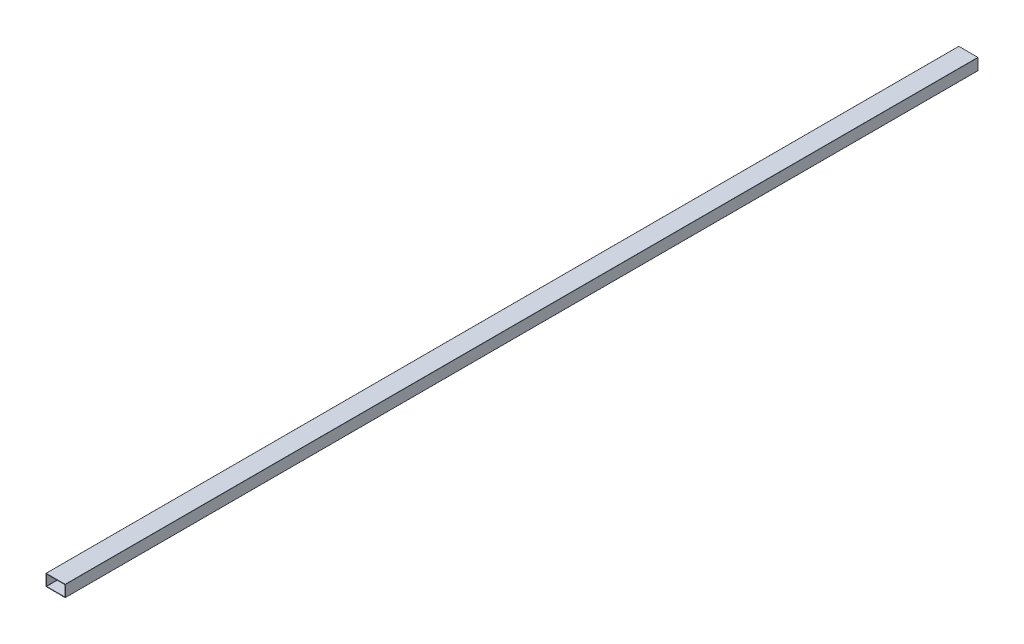
ISO-10303-21;
HEADER;
FILE_DESCRIPTION(('STEP AP214'),'2;1');
FILE_NAME('part.step','',(''),(''),'','','');
FILE_SCHEMA(('AUTOMOTIVE_DESIGN { 1 0 10303 214 1 1 1 1 }'));
ENDSEC;
DATA;
#1=APPLICATION_CONTEXT('core data for automotive mechanical design processes');
#2=APPLICATION_PROTOCOL_DEFINITION('international standard','automotive_design',2000,#1);
#3=PRODUCT_CONTEXT('',#1,'mechanical');
#4=PRODUCT('Part','Part','',(#3));
#5=PRODUCT_RELATED_PRODUCT_CATEGORY('part','',(#4));
#6=PRODUCT_DEFINITION_FORMATION('','',#4);
#7=PRODUCT_DEFINITION_CONTEXT('part definition',#1,'design');
#8=PRODUCT_DEFINITION('design','',#6,#7);
#9=PRODUCT_DEFINITION_SHAPE('','',#8);
#10=(LENGTH_UNIT() NAMED_UNIT(*) SI_UNIT(.MILLI.,.METRE.));
#11=(NAMED_UNIT(*) PLANE_ANGLE_UNIT() SI_UNIT($,.RADIAN.));
#12=(NAMED_UNIT(*) SI_UNIT($,.STERADIAN.) SOLID_ANGLE_UNIT());
#13=UNCERTAINTY_MEASURE_WITH_UNIT(LENGTH_MEASURE(1.E-05),#10,'distance_accuracy_value','');
#14=(GEOMETRIC_REPRESENTATION_CONTEXT(3) GLOBAL_UNCERTAINTY_ASSIGNED_CONTEXT((#13)) GLOBAL_UNIT_ASSIGNED_CONTEXT((#10,
#11,#12)) REPRESENTATION_CONTEXT('',''));
#15=CARTESIAN_POINT('',(0.,0.,0.));
#16=DIRECTION('',(0.,0.,1.));
#17=DIRECTION('',(1.,0.,0.));
#18=AXIS2_PLACEMENT_3D('',#15,#16,#17);
#19=CARTESIAN_POINT('',(63.5,-38.1,-6000.));
#20=DIRECTION('',(1.,0.,0.));
#21=DIRECTION('',(0.,0.,-1.));
#22=AXIS2_PLACEMENT_3D('',#19,#20,#21);
#23=PLANE('',#22);
#24=DIRECTION('',(0.,1.,0.));
#25=VECTOR('',#24,1.);
#26=CARTESIAN_POINT('',(63.5,-38.1,0.));
#27=LINE('',#26,#25);
#28=CARTESIAN_POINT('',(63.5,-37.1,0.));
#29=VERTEX_POINT('',#28);
#30=CARTESIAN_POINT('',(63.5,37.1,0.));
#31=VERTEX_POINT('',#30);
#32=EDGE_CURVE('E197',#29,#31,#27,.T.);
#33=ORIENTED_EDGE('',*,*,#32,.F.);
#34=DIRECTION('',(0.,0.,1.));
#35=VECTOR('',#34,1.);
#36=CARTESIAN_POINT('',(63.5,-37.1,-6000.));
#37=LINE('',#36,#35);
#38=CARTESIAN_POINT('',(63.5,-37.1,-6000.));
#39=VERTEX_POINT('',#38);
#40=EDGE_CURVE('E158',#29,#39,#37,.F.);
#41=ORIENTED_EDGE('',*,*,#40,.T.);
#42=DIRECTION('',(0.,1.,0.));
#43=VECTOR('',#42,1.);
#44=CARTESIAN_POINT('',(63.5,-38.1,-6000.));
#45=LINE('',#44,#43);
#46=CARTESIAN_POINT('',(63.5,37.1,-6000.));
#47=VERTEX_POINT('',#46);
#48=EDGE_CURVE('E185',#39,#47,#45,.T.);
#49=ORIENTED_EDGE('',*,*,#48,.T.);
#50=DIRECTION('',(0.,0.,1.));
#51=VECTOR('',#50,1.);
#52=CARTESIAN_POINT('',(63.5,37.1,-6000.));
#53=LINE('',#52,#51);
#54=EDGE_CURVE('E251',#47,#31,#53,.T.);
#55=ORIENTED_EDGE('',*,*,#54,.T.);
#56=EDGE_LOOP('',(#33,#41,#49,#55));
#57=FACE_BOUND('',#56,.T.);
#58=ADVANCED_FACE('F33',(#57),#23,.T.);
#59=CARTESIAN_POINT('',(-63.5,-38.1,-6000.));
#60=DIRECTION('',(0.,-1.,0.));
#61=DIRECTION('',(0.,0.,-1.));
#62=AXIS2_PLACEMENT_3D('',#59,#60,#61);
#63=PLANE('',#62);
#64=DIRECTION('',(1.,0.,0.));
#65=VECTOR('',#64,1.);
#66=CARTESIAN_POINT('',(-63.5,-38.1,0.));
#67=LINE('',#66,#65);
#68=CARTESIAN_POINT('',(-62.5,-38.1,0.));
#69=VERTEX_POINT('',#68);
#70=CARTESIAN_POINT('',(62.5,-38.1,0.));
#71=VERTEX_POINT('',#70);
#72=EDGE_CURVE('E189',#69,#71,#67,.T.);
#73=ORIENTED_EDGE('',*,*,#72,.F.);
#74=DIRECTION('',(0.,0.,1.));
#75=VECTOR('',#74,1.);
#76=CARTESIAN_POINT('',(-62.5,-38.1,-6000.));
#77=LINE('',#76,#75);
#78=CARTESIAN_POINT('',(-62.5,-38.1,-6000.));
#79=VERTEX_POINT('',#78);
#80=EDGE_CURVE('E238',#69,#79,#77,.F.);
#81=ORIENTED_EDGE('',*,*,#80,.T.);
#82=DIRECTION('',(1.,0.,0.));
#83=VECTOR('',#82,1.);
#84=CARTESIAN_POINT('',(-63.5,-38.1,-6000.));
#85=LINE('',#84,#83);
#86=CARTESIAN_POINT('',(62.5,-38.1,-6000.));
#87=VERTEX_POINT('',#86);
#88=EDGE_CURVE('E194',#79,#87,#85,.T.);
#89=ORIENTED_EDGE('',*,*,#88,.T.);
#90=DIRECTION('',(0.,0.,1.));
#91=VECTOR('',#90,1.);
#92=CARTESIAN_POINT('',(62.5,-38.1,-6000.));
#93=LINE('',#92,#91);
#94=EDGE_CURVE('E235',#87,#71,#93,.T.);
#95=ORIENTED_EDGE('',*,*,#94,.T.);
#96=EDGE_LOOP('',(#73,#81,#89,#95));
#97=FACE_BOUND('',#96,.T.);
#98=ADVANCED_FACE('F305',(#97),#63,.T.);
#99=CARTESIAN_POINT('',(-63.5,-38.1,-6000.));
#100=DIRECTION('',(-1.,0.,0.));
#101=DIRECTION('',(0.,0.,1.));
#102=AXIS2_PLACEMENT_3D('',#99,#100,#101);
#103=PLANE('',#102);
#104=DIRECTION('',(0.,-1.,0.));
#105=VECTOR('',#104,1.);
#106=CARTESIAN_POINT('',(-63.5,-38.1,-6000.));
#107=LINE('',#106,#105);
#108=CARTESIAN_POINT('',(-63.5,37.1,-6000.));
#109=VERTEX_POINT('',#108);
#110=CARTESIAN_POINT('',(-63.5,-37.1,-6000.));
#111=VERTEX_POINT('',#110);
#112=EDGE_CURVE('E191',#109,#111,#107,.T.);
#113=ORIENTED_EDGE('',*,*,#112,.T.);
#114=DIRECTION('',(0.,0.,1.));
#115=VECTOR('',#114,1.);
#116=CARTESIAN_POINT('',(-63.5,-37.1,-6000.));
#117=LINE('',#116,#115);
#118=CARTESIAN_POINT('',(-63.5,-37.1,0.));
#119=VERTEX_POINT('',#118);
#120=EDGE_CURVE('E224',#111,#119,#117,.T.);
#121=ORIENTED_EDGE('',*,*,#120,.T.);
#122=DIRECTION('',(0.,-1.,0.));
#123=VECTOR('',#122,1.);
#124=CARTESIAN_POINT('',(-63.5,-38.1,0.));
#125=LINE('',#124,#123);
#126=CARTESIAN_POINT('',(-63.5,37.1,0.));
#127=VERTEX_POINT('',#126);
#128=EDGE_CURVE('E203',#127,#119,#125,.T.);
#129=ORIENTED_EDGE('',*,*,#128,.F.);
#130=DIRECTION('',(0.,0.,1.));
#131=VECTOR('',#130,1.);
#132=CARTESIAN_POINT('',(-63.5,37.1,-6000.));
#133=LINE('',#132,#131);
#134=EDGE_CURVE('E222',#127,#109,#133,.F.);
#135=ORIENTED_EDGE('',*,*,#134,.T.);
#136=EDGE_LOOP('',(#113,#121,#129,#135));
#137=FACE_BOUND('',#136,.T.);
#138=ADVANCED_FACE('F311',(#137),#103,.T.);
#139=CARTESIAN_POINT('',(-63.5,38.1,-6000.));
#140=DIRECTION('',(0.,1.,0.));
#141=DIRECTION('',(0.,0.,1.));
#142=AXIS2_PLACEMENT_3D('',#139,#140,#141);
#143=PLANE('',#142);
#144=DIRECTION('',(-1.,0.,0.));
#145=VECTOR('',#144,1.);
#146=CARTESIAN_POINT('',(-63.5,38.1,-6000.));
#147=LINE('',#146,#145);
#148=CARTESIAN_POINT('',(62.5,38.1,-6000.));
#149=VERTEX_POINT('',#148);
#150=CARTESIAN_POINT('',(-62.5,38.1,-6000.));
#151=VERTEX_POINT('',#150);
#152=EDGE_CURVE('E188',#149,#151,#147,.T.);
#153=ORIENTED_EDGE('',*,*,#152,.T.);
#154=DIRECTION('',(0.,0.,1.));
#155=VECTOR('',#154,1.);
#156=CARTESIAN_POINT('',(-62.5,38.1,-6000.));
#157=LINE('',#156,#155);
#158=CARTESIAN_POINT('',(-62.5,38.1,0.));
#159=VERTEX_POINT('',#158);
#160=EDGE_CURVE('E248',#151,#159,#157,.T.);
#161=ORIENTED_EDGE('',*,*,#160,.T.);
#162=DIRECTION('',(-1.,0.,0.));
#163=VECTOR('',#162,1.);
#164=CARTESIAN_POINT('',(-63.5,38.1,0.));
#165=LINE('',#164,#163);
#166=CARTESIAN_POINT('',(62.5,38.1,0.));
#167=VERTEX_POINT('',#166);
#168=EDGE_CURVE('E200',#167,#159,#165,.T.);
#169=ORIENTED_EDGE('',*,*,#168,.F.);
#170=DIRECTION('',(0.,0.,1.));
#171=VECTOR('',#170,1.);
#172=CARTESIAN_POINT('',(62.5,38.1,-6000.));
#173=LINE('',#172,#171);
#174=EDGE_CURVE('E55',#167,#149,#173,.F.);
#175=ORIENTED_EDGE('',*,*,#174,.T.);
#176=EDGE_LOOP('',(#153,#161,#169,#175));
#177=FACE_BOUND('',#176,.T.);
#178=ADVANCED_FACE('F316',(#177),#143,.T.);
#179=CARTESIAN_POINT('',(0.,0.,-6000.));
#180=DIRECTION('',(0.,0.,-1.));
#181=DIRECTION('',(-1.,0.,0.));
#182=AXIS2_PLACEMENT_3D('',#179,#180,#181);
#183=PLANE('',#182);
#184=DIRECTION('',(0.,-1.,0.));
#185=VECTOR('',#184,1.);
#186=CARTESIAN_POINT('',(-60.46,-35.06,-6000.));
#187=LINE('',#186,#185);
#188=CARTESIAN_POINT('',(-60.46,34.06,-6000.));
#189=VERTEX_POINT('',#188);
#190=CARTESIAN_POINT('',(-60.46,-34.06,-6000.));
#191=VERTEX_POINT('',#190);
#192=EDGE_CURVE('E167',#189,#191,#187,.T.);
#193=ORIENTED_EDGE('',*,*,#192,.T.);
#194=CARTESIAN_POINT('',(-59.46,-34.06,-6000.));
#195=DIRECTION('',(0.,0.,-1.));
#196=DIRECTION('',(-1.,0.,0.));
#197=AXIS2_PLACEMENT_3D('',#194,#195,#196);
#198=CIRCLE('',#197,1.);
#199=CARTESIAN_POINT('',(-59.46,-35.06,-6000.));
#200=VERTEX_POINT('',#199);
#201=EDGE_CURVE('E11',#191,#200,#198,.F.);
#202=ORIENTED_EDGE('',*,*,#201,.T.);
#203=DIRECTION('',(1.,0.,0.));
#204=VECTOR('',#203,1.);
#205=CARTESIAN_POINT('',(-60.46,-35.06,-6000.));
#206=LINE('',#205,#204);
#207=CARTESIAN_POINT('',(59.46,-35.06,-6000.));
#208=VERTEX_POINT('',#207);
#209=EDGE_CURVE('E175',#200,#208,#206,.T.);
#210=ORIENTED_EDGE('',*,*,#209,.T.);
#211=CARTESIAN_POINT('',(59.46,-34.06,-6000.));
#212=DIRECTION('',(0.,0.,-1.));
#213=DIRECTION('',(-1.,0.,0.));
#214=AXIS2_PLACEMENT_3D('',#211,#212,#213);
#215=CIRCLE('',#214,1.);
#216=CARTESIAN_POINT('',(60.46,-34.06,-6000.));
#217=VERTEX_POINT('',#216);
#218=EDGE_CURVE('E262',#208,#217,#215,.F.);
#219=ORIENTED_EDGE('',*,*,#218,.T.);
#220=DIRECTION('',(0.,1.,0.));
#221=VECTOR('',#220,1.);
#222=CARTESIAN_POINT('',(60.46,-35.06,-6000.));
#223=LINE('',#222,#221);
#224=CARTESIAN_POINT('',(60.46,34.06,-6000.));
#225=VERTEX_POINT('',#224);
#226=EDGE_CURVE('E179',#217,#225,#223,.T.);
#227=ORIENTED_EDGE('',*,*,#226,.T.);
#228=CARTESIAN_POINT('',(59.46,34.06,-6000.));
#229=DIRECTION('',(0.,0.,-1.));
#230=DIRECTION('',(-1.,0.,0.));
#231=AXIS2_PLACEMENT_3D('',#228,#229,#230);
#232=CIRCLE('',#231,1.);
#233=CARTESIAN_POINT('',(59.46,35.06,-6000.));
#234=VERTEX_POINT('',#233);
#235=EDGE_CURVE('E258',#225,#234,#232,.F.);
#236=ORIENTED_EDGE('',*,*,#235,.T.);
#237=DIRECTION('',(-1.,0.,0.));
#238=VECTOR('',#237,1.);
#239=CARTESIAN_POINT('',(-60.46,35.06,-6000.));
#240=LINE('',#239,#238);
#241=CARTESIAN_POINT('',(-59.46,35.06,-6000.));
#242=VERTEX_POINT('',#241);
#243=EDGE_CURVE('E277',#234,#242,#240,.T.);
#244=ORIENTED_EDGE('',*,*,#243,.T.);
#245=CARTESIAN_POINT('',(-59.46,34.06,-6000.));
#246=DIRECTION('',(0.,0.,-1.));
#247=DIRECTION('',(-1.,0.,0.));
#248=AXIS2_PLACEMENT_3D('',#245,#246,#247);
#249=CIRCLE('',#248,1.);
#250=EDGE_CURVE('E157',#242,#189,#249,.F.);
#251=ORIENTED_EDGE('',*,*,#250,.T.);
#252=EDGE_LOOP('',(#193,#202,#210,#219,#227,#236,#244,#251));
#253=FACE_BOUND('',#252,.T.);
#254=ORIENTED_EDGE('',*,*,#88,.F.);
#255=CARTESIAN_POINT('',(-62.5,-37.1,-6000.));
#256=DIRECTION('',(0.,0.,-1.));
#257=DIRECTION('',(-1.,0.,0.));
#258=AXIS2_PLACEMENT_3D('',#255,#256,#257);
#259=CIRCLE('',#258,1.);
#260=EDGE_CURVE('E245',#79,#111,#259,.T.);
#261=ORIENTED_EDGE('',*,*,#260,.T.);
#262=ORIENTED_EDGE('',*,*,#112,.F.);
#263=CARTESIAN_POINT('',(-62.5,37.1,-6000.));
#264=DIRECTION('',(0.,0.,-1.));
#265=DIRECTION('',(-1.,0.,0.));
#266=AXIS2_PLACEMENT_3D('',#263,#264,#265);
#267=CIRCLE('',#266,1.);
#268=EDGE_CURVE('E48',#109,#151,#267,.T.);
#269=ORIENTED_EDGE('',*,*,#268,.T.);
#270=ORIENTED_EDGE('',*,*,#152,.F.);
#271=CARTESIAN_POINT('',(62.5,37.1,-6000.));
#272=DIRECTION('',(0.,0.,-1.));
#273=DIRECTION('',(-1.,0.,0.));
#274=AXIS2_PLACEMENT_3D('',#271,#272,#273);
#275=CIRCLE('',#274,1.);
#276=EDGE_CURVE('E240',#149,#47,#275,.T.);
#277=ORIENTED_EDGE('',*,*,#276,.T.);
#278=ORIENTED_EDGE('',*,*,#48,.F.);
#279=CARTESIAN_POINT('',(62.5,-37.1,-6000.));
#280=DIRECTION('',(0.,0.,-1.));
#281=DIRECTION('',(-1.,0.,0.));
#282=AXIS2_PLACEMENT_3D('',#279,#280,#281);
#283=CIRCLE('',#282,1.);
#284=EDGE_CURVE('E242',#39,#87,#283,.T.);
#285=ORIENTED_EDGE('',*,*,#284,.T.);
#286=EDGE_LOOP('',(#254,#261,#262,#269,#270,#277,#278,#285));
#287=FACE_BOUND('',#286,.T.);
#288=ADVANCED_FACE('F267',(#253,#287),#183,.T.);
#289=CARTESIAN_POINT('',(0.,0.,0.));
#290=DIRECTION('',(0.,0.,-1.));
#291=DIRECTION('',(-1.,0.,0.));
#292=AXIS2_PLACEMENT_3D('',#289,#290,#291);
#293=PLANE('',#292);
#294=DIRECTION('',(0.,1.,0.));
#295=VECTOR('',#294,1.);
#296=CARTESIAN_POINT('',(60.46,-35.06,0.));
#297=LINE('',#296,#295);
#298=CARTESIAN_POINT('',(60.46,-34.06,0.));
#299=VERTEX_POINT('',#298);
#300=CARTESIAN_POINT('',(60.46,34.06,0.));
#301=VERTEX_POINT('',#300);
#302=EDGE_CURVE('E181',#299,#301,#297,.T.);
#303=ORIENTED_EDGE('',*,*,#302,.F.);
#304=CARTESIAN_POINT('',(59.46,-34.06,0.));
#305=DIRECTION('',(0.,0.,-1.));
#306=DIRECTION('',(-1.,0.,0.));
#307=AXIS2_PLACEMENT_3D('',#304,#305,#306);
#308=CIRCLE('',#307,1.);
#309=CARTESIAN_POINT('',(59.46,-35.06,0.));
#310=VERTEX_POINT('',#309);
#311=EDGE_CURVE('E260',#299,#310,#308,.T.);
#312=ORIENTED_EDGE('',*,*,#311,.T.);
#313=DIRECTION('',(1.,0.,0.));
#314=VECTOR('',#313,1.);
#315=CARTESIAN_POINT('',(-60.46,-35.06,0.));
#316=LINE('',#315,#314);
#317=CARTESIAN_POINT('',(-59.46,-35.06,0.));
#318=VERTEX_POINT('',#317);
#319=EDGE_CURVE('E281',#318,#310,#316,.T.);
#320=ORIENTED_EDGE('',*,*,#319,.F.);
#321=CARTESIAN_POINT('',(-59.46,-34.06,0.));
#322=DIRECTION('',(0.,0.,-1.));
#323=DIRECTION('',(-1.,0.,0.));
#324=AXIS2_PLACEMENT_3D('',#321,#322,#323);
#325=CIRCLE('',#324,1.);
#326=CARTESIAN_POINT('',(-60.46,-34.06,0.));
#327=VERTEX_POINT('',#326);
#328=EDGE_CURVE('E41',#318,#327,#325,.T.);
#329=ORIENTED_EDGE('',*,*,#328,.T.);
#330=DIRECTION('',(0.,-1.,0.));
#331=VECTOR('',#330,1.);
#332=CARTESIAN_POINT('',(-60.46,-35.06,0.));
#333=LINE('',#332,#331);
#334=CARTESIAN_POINT('',(-60.46,34.06,0.));
#335=VERTEX_POINT('',#334);
#336=EDGE_CURVE('E164',#335,#327,#333,.T.);
#337=ORIENTED_EDGE('',*,*,#336,.F.);
#338=CARTESIAN_POINT('',(-59.46,34.06,0.));
#339=DIRECTION('',(0.,0.,-1.));
#340=DIRECTION('',(-1.,0.,0.));
#341=AXIS2_PLACEMENT_3D('',#338,#339,#340);
#342=CIRCLE('',#341,1.);
#343=CARTESIAN_POINT('',(-59.46,35.06,0.));
#344=VERTEX_POINT('',#343);
#345=EDGE_CURVE('E147',#335,#344,#342,.T.);
#346=ORIENTED_EDGE('',*,*,#345,.T.);
#347=DIRECTION('',(-1.,0.,0.));
#348=VECTOR('',#347,1.);
#349=CARTESIAN_POINT('',(-60.46,35.06,0.));
#350=LINE('',#349,#348);
#351=CARTESIAN_POINT('',(59.46,35.06,0.));
#352=VERTEX_POINT('',#351);
#353=EDGE_CURVE('E176',#352,#344,#350,.T.);
#354=ORIENTED_EDGE('',*,*,#353,.F.);
#355=CARTESIAN_POINT('',(59.46,34.06,0.));
#356=DIRECTION('',(0.,0.,-1.));
#357=DIRECTION('',(-1.,0.,0.));
#358=AXIS2_PLACEMENT_3D('',#355,#356,#357);
#359=CIRCLE('',#358,1.);
#360=EDGE_CURVE('E256',#352,#301,#359,.T.);
#361=ORIENTED_EDGE('',*,*,#360,.T.);
#362=EDGE_LOOP('',(#303,#312,#320,#329,#337,#346,#354,#361));
#363=FACE_BOUND('',#362,.T.);
#364=ORIENTED_EDGE('',*,*,#128,.T.);
#365=CARTESIAN_POINT('',(-62.5,-37.1,0.));
#366=DIRECTION('',(0.,0.,-1.));
#367=DIRECTION('',(-1.,0.,0.));
#368=AXIS2_PLACEMENT_3D('',#365,#366,#367);
#369=CIRCLE('',#368,1.);
#370=EDGE_CURVE('E233',#119,#69,#369,.F.);
#371=ORIENTED_EDGE('',*,*,#370,.T.);
#372=ORIENTED_EDGE('',*,*,#72,.T.);
#373=CARTESIAN_POINT('',(62.5,-37.1,0.));
#374=DIRECTION('',(0.,0.,-1.));
#375=DIRECTION('',(-1.,0.,0.));
#376=AXIS2_PLACEMENT_3D('',#373,#374,#375);
#377=CIRCLE('',#376,1.);
#378=EDGE_CURVE('E229',#71,#29,#377,.F.);
#379=ORIENTED_EDGE('',*,*,#378,.T.);
#380=ORIENTED_EDGE('',*,*,#32,.T.);
#381=CARTESIAN_POINT('',(62.5,37.1,0.));
#382=DIRECTION('',(0.,0.,-1.));
#383=DIRECTION('',(-1.,0.,0.));
#384=AXIS2_PLACEMENT_3D('',#381,#382,#383);
#385=CIRCLE('',#384,1.);
#386=EDGE_CURVE('E227',#31,#167,#385,.F.);
#387=ORIENTED_EDGE('',*,*,#386,.T.);
#388=ORIENTED_EDGE('',*,*,#168,.T.);
#389=CARTESIAN_POINT('',(-62.5,37.1,0.));
#390=DIRECTION('',(0.,0.,-1.));
#391=DIRECTION('',(-1.,0.,0.));
#392=AXIS2_PLACEMENT_3D('',#389,#390,#391);
#393=CIRCLE('',#392,1.);
#394=EDGE_CURVE('E231',#159,#127,#393,.F.);
#395=ORIENTED_EDGE('',*,*,#394,.T.);
#396=EDGE_LOOP('',(#364,#371,#372,#379,#380,#387,#388,#395));
#397=FACE_BOUND('',#396,.T.);
#398=ADVANCED_FACE('F172',(#363,#397),#293,.F.);
#399=CARTESIAN_POINT('',(-60.46,-35.06,-6000.));
#400=DIRECTION('',(0.,-1.,0.));
#401=DIRECTION('',(0.,0.,-1.));
#402=AXIS2_PLACEMENT_3D('',#399,#400,#401);
#403=PLANE('',#402);
#404=ORIENTED_EDGE('',*,*,#319,.T.);
#405=DIRECTION('',(0.,0.,1.));
#406=VECTOR('',#405,1.);
#407=CARTESIAN_POINT('',(59.46,-35.06,-6000.));
#408=LINE('',#407,#406);
#409=EDGE_CURVE('E220',#310,#208,#408,.F.);
#410=ORIENTED_EDGE('',*,*,#409,.T.);
#411=ORIENTED_EDGE('',*,*,#209,.F.);
#412=DIRECTION('',(0.,0.,1.));
#413=VECTOR('',#412,1.);
#414=CARTESIAN_POINT('',(-59.46,-35.06,0.));
#415=LINE('',#414,#413);
#416=EDGE_CURVE('E217',#200,#318,#415,.T.);
#417=ORIENTED_EDGE('',*,*,#416,.T.);
#418=EDGE_LOOP('',(#404,#410,#411,#417));
#419=FACE_BOUND('',#418,.T.);
#420=ADVANCED_FACE('F283',(#419),#403,.F.);
#421=CARTESIAN_POINT('',(-60.46,-35.06,-6000.));
#422=DIRECTION('',(-1.,0.,0.));
#423=DIRECTION('',(0.,0.,1.));
#424=AXIS2_PLACEMENT_3D('',#421,#422,#423);
#425=PLANE('',#424);
#426=ORIENTED_EDGE('',*,*,#192,.F.);
#427=DIRECTION('',(0.,0.,1.));
#428=VECTOR('',#427,1.);
#429=CARTESIAN_POINT('',(-60.46,34.06,0.));
#430=LINE('',#429,#428);
#431=EDGE_CURVE('E151',#189,#335,#430,.T.);
#432=ORIENTED_EDGE('',*,*,#431,.T.);
#433=ORIENTED_EDGE('',*,*,#336,.T.);
#434=DIRECTION('',(0.,0.,1.));
#435=VECTOR('',#434,1.);
#436=CARTESIAN_POINT('',(-60.46,-34.06,-6000.));
#437=LINE('',#436,#435);
#438=EDGE_CURVE('E169',#327,#191,#437,.F.);
#439=ORIENTED_EDGE('',*,*,#438,.T.);
#440=EDGE_LOOP('',(#426,#432,#433,#439));
#441=FACE_BOUND('',#440,.T.);
#442=ADVANCED_FACE('F163',(#441),#425,.F.);
#443=CARTESIAN_POINT('',(-60.46,35.06,-6000.));
#444=DIRECTION('',(0.,1.,0.));
#445=DIRECTION('',(-1.,0.,0.));
#446=AXIS2_PLACEMENT_3D('',#443,#444,#445);
#447=PLANE('',#446);
#448=ORIENTED_EDGE('',*,*,#353,.T.);
#449=DIRECTION('',(0.,0.,1.));
#450=VECTOR('',#449,1.);
#451=CARTESIAN_POINT('',(-59.46,35.06,-6000.));
#452=LINE('',#451,#450);
#453=EDGE_CURVE('E152',#344,#242,#452,.F.);
#454=ORIENTED_EDGE('',*,*,#453,.T.);
#455=ORIENTED_EDGE('',*,*,#243,.F.);
#456=DIRECTION('',(0.,0.,1.));
#457=VECTOR('',#456,1.);
#458=CARTESIAN_POINT('',(59.46,35.06,0.));
#459=LINE('',#458,#457);
#460=EDGE_CURVE('E168',#234,#352,#459,.T.);
#461=ORIENTED_EDGE('',*,*,#460,.T.);
#462=EDGE_LOOP('',(#448,#454,#455,#461));
#463=FACE_BOUND('',#462,.T.);
#464=ADVANCED_FACE('F292',(#463),#447,.F.);
#465=CARTESIAN_POINT('',(60.46,-35.06,-6000.));
#466=DIRECTION('',(1.,0.,0.));
#467=DIRECTION('',(0.,0.,-1.));
#468=AXIS2_PLACEMENT_3D('',#465,#466,#467);
#469=PLANE('',#468);
#470=ORIENTED_EDGE('',*,*,#302,.T.);
#471=DIRECTION('',(0.,0.,1.));
#472=VECTOR('',#471,1.);
#473=CARTESIAN_POINT('',(60.46,34.06,-6000.));
#474=LINE('',#473,#472);
#475=EDGE_CURVE('E215',#301,#225,#474,.F.);
#476=ORIENTED_EDGE('',*,*,#475,.T.);
#477=ORIENTED_EDGE('',*,*,#226,.F.);
#478=DIRECTION('',(0.,0.,1.));
#479=VECTOR('',#478,1.);
#480=CARTESIAN_POINT('',(60.46,-34.06,0.));
#481=LINE('',#480,#479);
#482=EDGE_CURVE('E212',#217,#299,#481,.T.);
#483=ORIENTED_EDGE('',*,*,#482,.T.);
#484=EDGE_LOOP('',(#470,#476,#477,#483));
#485=FACE_BOUND('',#484,.T.);
#486=ADVANCED_FACE('F275',(#485),#469,.F.);
#487=CARTESIAN_POINT('',(-59.46,34.06,-6000.));
#488=DIRECTION('',(0.,0.,-1.));
#489=DIRECTION('',(-1.,0.,0.));
#490=AXIS2_PLACEMENT_3D('',#487,#488,#489);
#491=CYLINDRICAL_SURFACE('',#490,1.);
#492=ORIENTED_EDGE('',*,*,#250,.F.);
#493=ORIENTED_EDGE('',*,*,#453,.F.);
#494=ORIENTED_EDGE('',*,*,#345,.F.);
#495=ORIENTED_EDGE('',*,*,#431,.F.);
#496=EDGE_LOOP('',(#492,#493,#494,#495));
#497=FACE_BOUND('',#496,.T.);
#498=ADVANCED_FACE('F150',(#497),#491,.F.);
#499=CARTESIAN_POINT('',(59.46,34.06,-6000.));
#500=DIRECTION('',(0.,0.,-1.));
#501=DIRECTION('',(-1.,0.,0.));
#502=AXIS2_PLACEMENT_3D('',#499,#500,#501);
#503=CYLINDRICAL_SURFACE('',#502,1.);
#504=ORIENTED_EDGE('',*,*,#235,.F.);
#505=ORIENTED_EDGE('',*,*,#475,.F.);
#506=ORIENTED_EDGE('',*,*,#360,.F.);
#507=ORIENTED_EDGE('',*,*,#460,.F.);
#508=EDGE_LOOP('',(#504,#505,#506,#507));
#509=FACE_BOUND('',#508,.T.);
#510=ADVANCED_FACE('F294',(#509),#503,.F.);
#511=CARTESIAN_POINT('',(59.46,-34.06,-6000.));
#512=DIRECTION('',(0.,0.,-1.));
#513=DIRECTION('',(-1.,0.,0.));
#514=AXIS2_PLACEMENT_3D('',#511,#512,#513);
#515=CYLINDRICAL_SURFACE('',#514,1.);
#516=ORIENTED_EDGE('',*,*,#218,.F.);
#517=ORIENTED_EDGE('',*,*,#409,.F.);
#518=ORIENTED_EDGE('',*,*,#311,.F.);
#519=ORIENTED_EDGE('',*,*,#482,.F.);
#520=EDGE_LOOP('',(#516,#517,#518,#519));
#521=FACE_BOUND('',#520,.T.);
#522=ADVANCED_FACE('F279',(#521),#515,.F.);
#523=CARTESIAN_POINT('',(-62.5,-37.1,-6000.));
#524=DIRECTION('',(0.,0.,1.));
#525=DIRECTION('',(1.,0.,0.));
#526=AXIS2_PLACEMENT_3D('',#523,#524,#525);
#527=CYLINDRICAL_SURFACE('',#526,1.);
#528=ORIENTED_EDGE('',*,*,#260,.F.);
#529=ORIENTED_EDGE('',*,*,#80,.F.);
#530=ORIENTED_EDGE('',*,*,#370,.F.);
#531=ORIENTED_EDGE('',*,*,#120,.F.);
#532=EDGE_LOOP('',(#528,#529,#530,#531));
#533=FACE_BOUND('',#532,.T.);
#534=ADVANCED_FACE('F301',(#533),#527,.T.);
#535=CARTESIAN_POINT('',(-62.5,37.1,-6000.));
#536=DIRECTION('',(0.,0.,1.));
#537=DIRECTION('',(1.,0.,0.));
#538=AXIS2_PLACEMENT_3D('',#535,#536,#537);
#539=CYLINDRICAL_SURFACE('',#538,1.);
#540=ORIENTED_EDGE('',*,*,#268,.F.);
#541=ORIENTED_EDGE('',*,*,#134,.F.);
#542=ORIENTED_EDGE('',*,*,#394,.F.);
#543=ORIENTED_EDGE('',*,*,#160,.F.);
#544=EDGE_LOOP('',(#540,#541,#542,#543));
#545=FACE_BOUND('',#544,.T.);
#546=ADVANCED_FACE('F368',(#545),#539,.T.);
#547=CARTESIAN_POINT('',(-59.46,-34.06,-6000.));
#548=DIRECTION('',(0.,0.,-1.));
#549=DIRECTION('',(-1.,0.,0.));
#550=AXIS2_PLACEMENT_3D('',#547,#548,#549);
#551=CYLINDRICAL_SURFACE('',#550,1.);
#552=ORIENTED_EDGE('',*,*,#201,.F.);
#553=ORIENTED_EDGE('',*,*,#438,.F.);
#554=ORIENTED_EDGE('',*,*,#328,.F.);
#555=ORIENTED_EDGE('',*,*,#416,.F.);
#556=EDGE_LOOP('',(#552,#553,#554,#555));
#557=FACE_BOUND('',#556,.T.);
#558=ADVANCED_FACE('F378',(#557),#551,.F.);
#559=CARTESIAN_POINT('',(62.5,-37.1,-6000.));
#560=DIRECTION('',(0.,0.,1.));
#561=DIRECTION('',(1.,0.,0.));
#562=AXIS2_PLACEMENT_3D('',#559,#560,#561);
#563=CYLINDRICAL_SURFACE('',#562,1.);
#564=ORIENTED_EDGE('',*,*,#284,.F.);
#565=ORIENTED_EDGE('',*,*,#40,.F.);
#566=ORIENTED_EDGE('',*,*,#378,.F.);
#567=ORIENTED_EDGE('',*,*,#94,.F.);
#568=EDGE_LOOP('',(#564,#565,#566,#567));
#569=FACE_BOUND('',#568,.T.);
#570=ADVANCED_FACE('F388',(#569),#563,.T.);
#571=CARTESIAN_POINT('',(62.5,37.1,-6000.));
#572=DIRECTION('',(0.,0.,1.));
#573=DIRECTION('',(1.,0.,0.));
#574=AXIS2_PLACEMENT_3D('',#571,#572,#573);
#575=CYLINDRICAL_SURFACE('',#574,1.);
#576=ORIENTED_EDGE('',*,*,#276,.F.);
#577=ORIENTED_EDGE('',*,*,#174,.F.);
#578=ORIENTED_EDGE('',*,*,#386,.F.);
#579=ORIENTED_EDGE('',*,*,#54,.F.);
#580=EDGE_LOOP('',(#576,#577,#578,#579));
#581=FACE_BOUND('',#580,.T.);
#582=ADVANCED_FACE('F35',(#581),#575,.T.);
#583=CLOSED_SHELL('',(#58,#98,#138,#178,#288,#398,#420,#442,#464,#486,#498,#510,#522,#534,#546,
#558,#570,#582));
#584=MANIFOLD_SOLID_BREP('B2',#583);
#585=ADVANCED_BREP_SHAPE_REPRESENTATION('',(#18,#584),#14);
#586=SHAPE_DEFINITION_REPRESENTATION(#9,#585);
ENDSEC;
END-ISO-10303-21;
